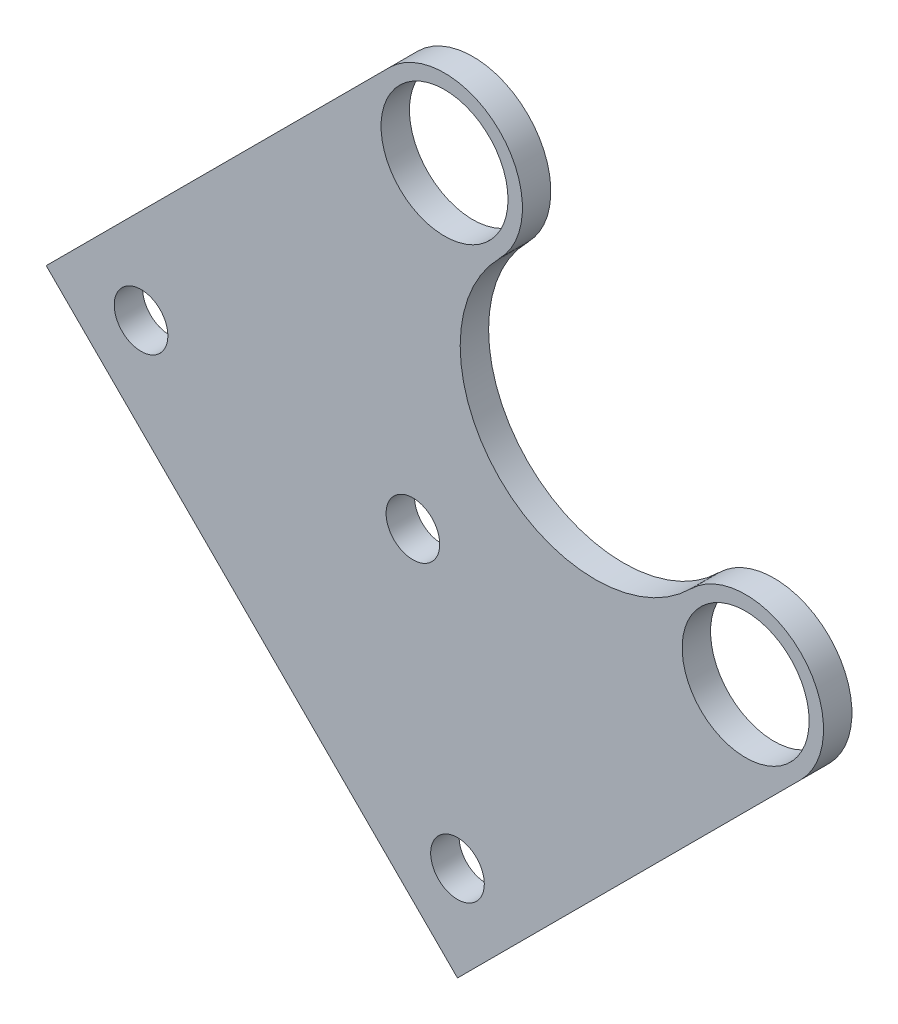
ISO-10303-21;
HEADER;
FILE_DESCRIPTION(('STEP AP214'),'2;1');
FILE_NAME('part.step','',(''),(''),'','','');
FILE_SCHEMA(('AUTOMOTIVE_DESIGN { 1 0 10303 214 1 1 1 1 }'));
ENDSEC;
DATA;
#1=APPLICATION_CONTEXT('core data for automotive mechanical design processes');
#2=APPLICATION_PROTOCOL_DEFINITION('international standard','automotive_design',2000,#1);
#3=PRODUCT_CONTEXT('',#1,'mechanical');
#4=PRODUCT('Part','Part','',(#3));
#5=PRODUCT_RELATED_PRODUCT_CATEGORY('part','',(#4));
#6=PRODUCT_DEFINITION_FORMATION('','',#4);
#7=PRODUCT_DEFINITION_CONTEXT('part definition',#1,'design');
#8=PRODUCT_DEFINITION('design','',#6,#7);
#9=PRODUCT_DEFINITION_SHAPE('','',#8);
#10=(LENGTH_UNIT() NAMED_UNIT(*) SI_UNIT(.MILLI.,.METRE.));
#11=(NAMED_UNIT(*) PLANE_ANGLE_UNIT() SI_UNIT($,.RADIAN.));
#12=(NAMED_UNIT(*) SI_UNIT($,.STERADIAN.) SOLID_ANGLE_UNIT());
#13=UNCERTAINTY_MEASURE_WITH_UNIT(LENGTH_MEASURE(1.E-05),#10,'distance_accuracy_value','');
#14=(GEOMETRIC_REPRESENTATION_CONTEXT(3) GLOBAL_UNCERTAINTY_ASSIGNED_CONTEXT((#13)) GLOBAL_UNIT_ASSIGNED_CONTEXT((#10,
#11,#12)) REPRESENTATION_CONTEXT('',''));
#15=CARTESIAN_POINT('',(0.,0.,0.));
#16=DIRECTION('',(0.,0.,1.));
#17=DIRECTION('',(1.,0.,0.));
#18=AXIS2_PLACEMENT_3D('',#15,#16,#17);
#19=CARTESIAN_POINT('',(15.9750784843009,15.9750784843008,3.175));
#20=DIRECTION('',(-0.70710678118655,-0.707106781186545,0.));
#21=DIRECTION('',(0.707106781186545,-0.70710678118655,0.));
#22=AXIS2_PLACEMENT_3D('',#19,#20,#21);
#23=PLANE('',#22);
#24=DIRECTION('',(-0.707106781186545,0.70710678118655,0.));
#25=VECTOR('',#24,1.);
#26=CARTESIAN_POINT('',(15.9750784843009,15.9750784843008,0.));
#27=LINE('',#26,#25);
#28=CARTESIAN_POINT('',(17.1358644103588,14.8142925582428,0.));
#29=VERTEX_POINT('',#28);
#30=CARTESIAN_POINT('',(-28.8610074417573,60.8111644103593,0.));
#31=VERTEX_POINT('',#30);
#32=EDGE_CURVE('E179',#29,#31,#27,.T.);
#33=ORIENTED_EDGE('',*,*,#32,.F.);
#34=DIRECTION('',(0.,0.,-1.));
#35=VECTOR('',#34,1.);
#36=CARTESIAN_POINT('',(17.1358644103588,14.8142925582428,3.175));
#37=LINE('',#36,#35);
#38=CARTESIAN_POINT('',(17.1358644103588,14.8142925582428,3.175));
#39=VERTEX_POINT('',#38);
#40=EDGE_CURVE('E11',#39,#29,#37,.T.);
#41=ORIENTED_EDGE('',*,*,#40,.F.);
#42=DIRECTION('',(-0.707106781186545,0.70710678118655,0.));
#43=VECTOR('',#42,1.);
#44=CARTESIAN_POINT('',(15.9750784843009,15.9750784843008,3.175));
#45=LINE('',#44,#43);
#46=CARTESIAN_POINT('',(-28.8610074417573,60.8111644103593,3.175));
#47=VERTEX_POINT('',#46);
#48=EDGE_CURVE('E289',#39,#47,#45,.T.);
#49=ORIENTED_EDGE('',*,*,#48,.T.);
#50=DIRECTION('',(0.,0.,-1.));
#51=VECTOR('',#50,1.);
#52=CARTESIAN_POINT('',(-28.8610074417573,60.8111644103593,3.175));
#53=LINE('',#52,#51);
#54=EDGE_CURVE('E97',#47,#31,#53,.T.);
#55=ORIENTED_EDGE('',*,*,#54,.T.);
#56=EDGE_LOOP('',(#33,#41,#49,#55));
#57=FACE_BOUND('',#56,.T.);
#58=ADVANCED_FACE('F45',(#57),#23,.T.);
#59=CARTESIAN_POINT('',(1.16078592605792,-1.16078592605793,3.175));
#60=DIRECTION('',(0.707106781186545,-0.70710678118655,0.));
#61=DIRECTION('',(0.70710678118655,0.707106781186545,0.));
#62=AXIS2_PLACEMENT_3D('',#59,#60,#61);
#63=PLANE('',#62);
#64=DIRECTION('',(-0.70710678118655,-0.707106781186545,0.));
#65=VECTOR('',#64,1.);
#66=CARTESIAN_POINT('',(1.16078592605792,-1.16078592605793,0.));
#67=LINE('',#66,#65);
#68=CARTESIAN_POINT('',(55.5231359260591,53.2015640739429,0.));
#69=VERTEX_POINT('',#68);
#70=EDGE_CURVE('E171',#69,#29,#67,.T.);
#71=ORIENTED_EDGE('',*,*,#70,.F.);
#72=DIRECTION('',(0.,0.,-1.));
#73=VECTOR('',#72,1.);
#74=CARTESIAN_POINT('',(55.5231359260591,53.2015640739429,3.175));
#75=LINE('',#74,#73);
#76=CARTESIAN_POINT('',(55.5231359260591,53.2015640739429,3.175));
#77=VERTEX_POINT('',#76);
#78=EDGE_CURVE('E55',#77,#69,#75,.T.);
#79=ORIENTED_EDGE('',*,*,#78,.F.);
#80=DIRECTION('',(-0.70710678118655,-0.707106781186545,0.));
#81=VECTOR('',#80,1.);
#82=CARTESIAN_POINT('',(1.16078592605792,-1.16078592605793,3.175));
#83=LINE('',#82,#81);
#84=EDGE_CURVE('E293',#77,#39,#83,.T.);
#85=ORIENTED_EDGE('',*,*,#84,.T.);
#86=ORIENTED_EDGE('',*,*,#40,.T.);
#87=EDGE_LOOP('',(#71,#79,#85,#86));
#88=FACE_BOUND('',#87,.T.);
#89=ADVANCED_FACE('F177',(#88),#63,.T.);
#90=CARTESIAN_POINT('',(49.3626802270047,59.3620197729953,3.175));
#91=DIRECTION('',(0.,0.,-1.));
#92=DIRECTION('',(-1.,0.,0.));
#93=AXIS2_PLACEMENT_3D('',#90,#91,#92);
#94=CYLINDRICAL_SURFACE('',#93,8.71219999999999);
#95=CARTESIAN_POINT('',(49.3626802270047,59.3620197729953,0.));
#96=DIRECTION('',(0.,0.,1.));
#97=DIRECTION('',(1.,0.,0.));
#98=AXIS2_PLACEMENT_3D('',#95,#96,#97);
#99=CIRCLE('',#98,8.71219999999999);
#100=CARTESIAN_POINT('',(43.2022245279513,65.5224754720488,0.));
#101=VERTEX_POINT('',#100);
#102=EDGE_CURVE('E161',#69,#101,#99,.T.);
#103=ORIENTED_EDGE('',*,*,#102,.T.);
#104=DIRECTION('',(0.,0.,-1.));
#105=VECTOR('',#104,1.);
#106=CARTESIAN_POINT('',(43.2022245279513,65.5224754720488,3.175));
#107=LINE('',#106,#105);
#108=CARTESIAN_POINT('',(43.2022245279513,65.5224754720488,3.175));
#109=VERTEX_POINT('',#108);
#110=EDGE_CURVE('E151',#109,#101,#107,.T.);
#111=ORIENTED_EDGE('',*,*,#110,.F.);
#112=CARTESIAN_POINT('',(49.3626802270047,59.3620197729953,3.175));
#113=DIRECTION('',(0.,0.,1.));
#114=DIRECTION('',(1.,0.,0.));
#115=AXIS2_PLACEMENT_3D('',#112,#113,#114);
#116=CIRCLE('',#115,8.71219999999999);
#117=EDGE_CURVE('E163',#77,#109,#116,.T.);
#118=ORIENTED_EDGE('',*,*,#117,.F.);
#119=ORIENTED_EDGE('',*,*,#78,.T.);
#120=EDGE_LOOP('',(#103,#111,#118,#119));
#121=FACE_BOUND('',#120,.T.);
#122=ADVANCED_FACE('F159',(#121),#94,.T.);
#123=CARTESIAN_POINT('',(54.3623500000167,54.3623499999747,3.175));
#124=DIRECTION('',(-0.707106781186821,-0.707106781186274,0.));
#125=DIRECTION('',(0.707106781186274,-0.707106781186821,0.));
#126=AXIS2_PLACEMENT_3D('',#123,#124,#125);
#127=PLANE('',#126);
#128=DIRECTION('',(-0.707106781186274,0.707106781186821,0.));
#129=VECTOR('',#128,1.);
#130=CARTESIAN_POINT('',(54.3623500000167,54.3623499999747,0.));
#131=LINE('',#130,#129);
#132=CARTESIAN_POINT('',(43.1932442718302,65.5314557281699,0.));
#133=VERTEX_POINT('',#132);
#134=EDGE_CURVE('E174',#101,#133,#131,.T.);
#135=ORIENTED_EDGE('',*,*,#134,.T.);
#136=DIRECTION('',(0.,0.,-1.));
#137=VECTOR('',#136,1.);
#138=CARTESIAN_POINT('',(43.1932442718302,65.5314557281699,3.175));
#139=LINE('',#138,#137);
#140=CARTESIAN_POINT('',(43.1932442718302,65.5314557281699,3.175));
#141=VERTEX_POINT('',#140);
#142=EDGE_CURVE('E144',#141,#133,#139,.T.);
#143=ORIENTED_EDGE('',*,*,#142,.F.);
#144=DIRECTION('',(-0.707106781186274,0.707106781186821,0.));
#145=VECTOR('',#144,1.);
#146=CARTESIAN_POINT('',(54.3623500000167,54.3623499999747,3.175));
#147=LINE('',#146,#145);
#148=EDGE_CURVE('E301',#109,#141,#147,.T.);
#149=ORIENTED_EDGE('',*,*,#148,.F.);
#150=ORIENTED_EDGE('',*,*,#110,.T.);
#151=EDGE_LOOP('',(#135,#143,#149,#150));
#152=FACE_BOUND('',#151,.T.);
#153=ADVANCED_FACE('F255',(#152),#127,.F.);
#154=CARTESIAN_POINT('',(32.5247,76.2,3.175));
#155=DIRECTION('',(0.,0.,-1.));
#156=DIRECTION('',(-1.,0.,0.));
#157=AXIS2_PLACEMENT_3D('',#154,#155,#156);
#158=CYLINDRICAL_SURFACE('',#157,15.0876);
#159=CARTESIAN_POINT('',(32.5247,76.2,0.));
#160=DIRECTION('',(0.,0.,1.));
#161=DIRECTION('',(1.,0.,0.));
#162=AXIS2_PLACEMENT_3D('',#159,#160,#161);
#163=CIRCLE('',#162,15.0876);
#164=CARTESIAN_POINT('',(21.8561557281699,86.8685442718302,0.));
#165=VERTEX_POINT('',#164);
#166=EDGE_CURVE('E188',#165,#133,#163,.T.);
#167=ORIENTED_EDGE('',*,*,#166,.F.);
#168=DIRECTION('',(0.,0.,-1.));
#169=VECTOR('',#168,1.);
#170=CARTESIAN_POINT('',(21.8561557281699,86.8685442718302,3.175));
#171=LINE('',#170,#169);
#172=CARTESIAN_POINT('',(21.8561557281699,86.8685442718302,3.175));
#173=VERTEX_POINT('',#172);
#174=EDGE_CURVE('E140',#173,#165,#171,.T.);
#175=ORIENTED_EDGE('',*,*,#174,.F.);
#176=CARTESIAN_POINT('',(32.5247,76.2,3.175));
#177=DIRECTION('',(0.,0.,1.));
#178=DIRECTION('',(1.,0.,0.));
#179=AXIS2_PLACEMENT_3D('',#176,#177,#178);
#180=CIRCLE('',#179,15.0876);
#181=EDGE_CURVE('E132',#173,#141,#180,.T.);
#182=ORIENTED_EDGE('',*,*,#181,.T.);
#183=ORIENTED_EDGE('',*,*,#142,.T.);
#184=EDGE_LOOP('',(#167,#175,#182,#183));
#185=FACE_BOUND('',#184,.T.);
#186=ADVANCED_FACE('F258',(#185),#158,.F.);
#187=CARTESIAN_POINT('',(54.3623499999409,54.362350000235,3.175));
#188=DIRECTION('',(-0.707106781184635,-0.70710678118846,0.));
#189=DIRECTION('',(0.70710678118846,-0.707106781184635,0.));
#190=AXIS2_PLACEMENT_3D('',#187,#188,#189);
#191=PLANE('',#190);
#192=DIRECTION('',(-0.70710678118846,0.707106781184635,0.));
#193=VECTOR('',#192,1.);
#194=CARTESIAN_POINT('',(54.3623499999409,54.362350000235,0.));
#195=LINE('',#194,#193);
#196=CARTESIAN_POINT('',(21.8471754720488,86.8775245279512,0.));
#197=VERTEX_POINT('',#196);
#198=EDGE_CURVE('E138',#165,#197,#195,.T.);
#199=ORIENTED_EDGE('',*,*,#198,.T.);
#200=DIRECTION('',(0.,0.,-1.));
#201=VECTOR('',#200,1.);
#202=CARTESIAN_POINT('',(21.8471754720488,86.8775245279512,3.175));
#203=LINE('',#202,#201);
#204=CARTESIAN_POINT('',(21.8471754720488,86.8775245279512,3.175));
#205=VERTEX_POINT('',#204);
#206=EDGE_CURVE('E121',#205,#197,#203,.T.);
#207=ORIENTED_EDGE('',*,*,#206,.F.);
#208=DIRECTION('',(-0.70710678118846,0.707106781184635,0.));
#209=VECTOR('',#208,1.);
#210=CARTESIAN_POINT('',(54.3623499999409,54.362350000235,3.175));
#211=LINE('',#210,#209);
#212=EDGE_CURVE('E125',#173,#205,#211,.T.);
#213=ORIENTED_EDGE('',*,*,#212,.F.);
#214=ORIENTED_EDGE('',*,*,#174,.T.);
#215=EDGE_LOOP('',(#199,#207,#213,#214));
#216=FACE_BOUND('',#215,.T.);
#217=ADVANCED_FACE('F136',(#216),#191,.F.);
#218=CARTESIAN_POINT('',(15.6867197729953,93.0379802270047,3.175));
#219=DIRECTION('',(0.,0.,-1.));
#220=DIRECTION('',(-1.,0.,0.));
#221=AXIS2_PLACEMENT_3D('',#218,#219,#220);
#222=CYLINDRICAL_SURFACE('',#221,8.71220000000003);
#223=CARTESIAN_POINT('',(15.6867197729953,93.0379802270047,0.));
#224=DIRECTION('',(0.,0.,1.));
#225=DIRECTION('',(1.,0.,0.));
#226=AXIS2_PLACEMENT_3D('',#223,#224,#225);
#227=CIRCLE('',#226,8.71220000000003);
#228=CARTESIAN_POINT('',(9.52626407394171,99.198435926058,0.));
#229=VERTEX_POINT('',#228);
#230=EDGE_CURVE('E193',#197,#229,#227,.T.);
#231=ORIENTED_EDGE('',*,*,#230,.T.);
#232=DIRECTION('',(0.,0.,-1.));
#233=VECTOR('',#232,1.);
#234=CARTESIAN_POINT('',(9.52626407394171,99.198435926058,3.175));
#235=LINE('',#234,#233);
#236=CARTESIAN_POINT('',(9.52626407394171,99.198435926058,3.175));
#237=VERTEX_POINT('',#236);
#238=EDGE_CURVE('E123',#237,#229,#235,.T.);
#239=ORIENTED_EDGE('',*,*,#238,.F.);
#240=CARTESIAN_POINT('',(15.6867197729953,93.0379802270047,3.175));
#241=DIRECTION('',(0.,0.,1.));
#242=DIRECTION('',(1.,0.,0.));
#243=AXIS2_PLACEMENT_3D('',#240,#241,#242);
#244=CIRCLE('',#243,8.71220000000003);
#245=EDGE_CURVE('E116',#205,#237,#244,.T.);
#246=ORIENTED_EDGE('',*,*,#245,.F.);
#247=ORIENTED_EDGE('',*,*,#206,.T.);
#248=EDGE_LOOP('',(#231,#239,#246,#247));
#249=FACE_BOUND('',#248,.T.);
#250=ADVANCED_FACE('F119',(#249),#222,.T.);
#251=CARTESIAN_POINT('',(49.3626802270047,59.3620197729953,3.175));
#252=DIRECTION('',(0.,0.,-1.));
#253=DIRECTION('',(-1.,0.,0.));
#254=AXIS2_PLACEMENT_3D('',#251,#252,#253);
#255=CYLINDRICAL_SURFACE('',#254,7.1);
#256=CARTESIAN_POINT('',(49.3626802270047,59.3620197729953,3.175));
#257=DIRECTION('',(0.,0.,1.));
#258=DIRECTION('',(1.,0.,0.));
#259=AXIS2_PLACEMENT_3D('',#256,#257,#258);
#260=CIRCLE('',#259,7.1);
#261=CARTESIAN_POINT('',(56.4626802270047,59.3620197729953,3.175));
#262=VERTEX_POINT('',#261);
#263=EDGE_CURVE('E214',#262,#262,#260,.T.);
#264=ORIENTED_EDGE('',*,*,#263,.T.);
#265=EDGE_LOOP('',(#264));
#266=FACE_BOUND('',#265,.T.);
#267=CARTESIAN_POINT('',(49.3626802270047,59.3620197729953,0.));
#268=DIRECTION('',(0.,0.,1.));
#269=DIRECTION('',(1.,0.,0.));
#270=AXIS2_PLACEMENT_3D('',#267,#268,#269);
#271=CIRCLE('',#270,7.1);
#272=CARTESIAN_POINT('',(56.4626802270047,59.3620197729953,0.));
#273=VERTEX_POINT('',#272);
#274=EDGE_CURVE('E202',#273,#273,#271,.T.);
#275=ORIENTED_EDGE('',*,*,#274,.F.);
#276=EDGE_LOOP('',(#275));
#277=FACE_BOUND('',#276,.T.);
#278=ADVANCED_FACE('F266',(#266,#277),#255,.F.);
#279=CARTESIAN_POINT('',(12.1511858670625,55.8264858670626,3.175));
#280=DIRECTION('',(0.,0.,-1.));
#281=DIRECTION('',(-1.,0.,0.));
#282=AXIS2_PLACEMENT_3D('',#279,#280,#281);
#283=CYLINDRICAL_SURFACE('',#282,3.00000000000002);
#284=CARTESIAN_POINT('',(12.1511858670625,55.8264858670626,3.175));
#285=DIRECTION('',(0.,0.,1.));
#286=DIRECTION('',(1.,0.,0.));
#287=AXIS2_PLACEMENT_3D('',#284,#285,#286);
#288=CIRCLE('',#287,3.00000000000002);
#289=CARTESIAN_POINT('',(15.1511858670625,55.8264858670626,3.175));
#290=VERTEX_POINT('',#289);
#291=EDGE_CURVE('E220',#290,#290,#288,.T.);
#292=ORIENTED_EDGE('',*,*,#291,.T.);
#293=EDGE_LOOP('',(#292));
#294=FACE_BOUND('',#293,.T.);
#295=CARTESIAN_POINT('',(12.1511858670625,55.8264858670626,0.));
#296=DIRECTION('',(0.,0.,1.));
#297=DIRECTION('',(1.,0.,0.));
#298=AXIS2_PLACEMENT_3D('',#295,#296,#297);
#299=CIRCLE('',#298,3.00000000000002);
#300=CARTESIAN_POINT('',(15.1511858670625,55.8264858670626,0.));
#301=VERTEX_POINT('',#300);
#302=EDGE_CURVE('E198',#301,#301,#299,.T.);
#303=ORIENTED_EDGE('',*,*,#302,.F.);
#304=EDGE_LOOP('',(#303));
#305=FACE_BOUND('',#304,.T.);
#306=ADVANCED_FACE('F242',(#294,#305),#283,.F.);
#307=CARTESIAN_POINT('',(-44.8360859260582,44.8360859260585,3.175));
#308=DIRECTION('',(0.707106781186545,-0.70710678118655,0.));
#309=DIRECTION('',(0.70710678118655,0.707106781186545,0.));
#310=AXIS2_PLACEMENT_3D('',#307,#308,#309);
#311=PLANE('',#310);
#312=DIRECTION('',(-0.70710678118655,-0.707106781186545,0.));
#313=VECTOR('',#312,1.);
#314=CARTESIAN_POINT('',(-44.8360859260582,44.8360859260585,0.));
#315=LINE('',#314,#313);
#316=EDGE_CURVE('E90',#229,#31,#315,.T.);
#317=ORIENTED_EDGE('',*,*,#316,.T.);
#318=ORIENTED_EDGE('',*,*,#54,.F.);
#319=DIRECTION('',(-0.70710678118655,-0.707106781186545,0.));
#320=VECTOR('',#319,1.);
#321=CARTESIAN_POINT('',(-44.8360859260582,44.8360859260585,3.175));
#322=LINE('',#321,#320);
#323=EDGE_CURVE('E63',#237,#47,#322,.T.);
#324=ORIENTED_EDGE('',*,*,#323,.F.);
#325=ORIENTED_EDGE('',*,*,#238,.T.);
#326=EDGE_LOOP('',(#317,#318,#324,#325));
#327=FACE_BOUND('',#326,.T.);
#328=ADVANCED_FACE('F234',(#327),#311,.F.);
#329=CARTESIAN_POINT('',(-18.254405723959,60.8111644103593,3.175));
#330=DIRECTION('',(0.,0.,-1.));
#331=DIRECTION('',(-1.,0.,0.));
#332=AXIS2_PLACEMENT_3D('',#329,#330,#331);
#333=CYLINDRICAL_SURFACE('',#332,3.);
#334=CARTESIAN_POINT('',(-18.254405723959,60.8111644103593,3.175));
#335=DIRECTION('',(0.,0.,1.));
#336=DIRECTION('',(1.,0.,0.));
#337=AXIS2_PLACEMENT_3D('',#334,#335,#336);
#338=CIRCLE('',#337,3.);
#339=CARTESIAN_POINT('',(-15.254405723959,60.8111644103593,3.175));
#340=VERTEX_POINT('',#339);
#341=EDGE_CURVE('E287',#340,#340,#338,.T.);
#342=ORIENTED_EDGE('',*,*,#341,.T.);
#343=EDGE_LOOP('',(#342));
#344=FACE_BOUND('',#343,.T.);
#345=CARTESIAN_POINT('',(-18.254405723959,60.8111644103593,0.));
#346=DIRECTION('',(0.,0.,1.));
#347=DIRECTION('',(1.,0.,0.));
#348=AXIS2_PLACEMENT_3D('',#345,#346,#347);
#349=CIRCLE('',#348,3.);
#350=CARTESIAN_POINT('',(-15.254405723959,60.8111644103593,0.));
#351=VERTEX_POINT('',#350);
#352=EDGE_CURVE('E182',#351,#351,#349,.T.);
#353=ORIENTED_EDGE('',*,*,#352,.F.);
#354=EDGE_LOOP('',(#353));
#355=FACE_BOUND('',#354,.T.);
#356=ADVANCED_FACE('F232',(#344,#355),#333,.F.);
#357=CARTESIAN_POINT('',(17.1358644103588,25.420894276041,3.175));
#358=DIRECTION('',(0.,0.,-1.));
#359=DIRECTION('',(-1.,0.,0.));
#360=AXIS2_PLACEMENT_3D('',#357,#358,#359);
#361=CYLINDRICAL_SURFACE('',#360,3.);
#362=CARTESIAN_POINT('',(17.1358644103588,25.420894276041,3.175));
#363=DIRECTION('',(0.,0.,1.));
#364=DIRECTION('',(1.,0.,0.));
#365=AXIS2_PLACEMENT_3D('',#362,#363,#364);
#366=CIRCLE('',#365,3.);
#367=CARTESIAN_POINT('',(20.1358644103588,25.420894276041,3.175));
#368=VERTEX_POINT('',#367);
#369=EDGE_CURVE('E209',#368,#368,#366,.T.);
#370=ORIENTED_EDGE('',*,*,#369,.T.);
#371=EDGE_LOOP('',(#370));
#372=FACE_BOUND('',#371,.T.);
#373=CARTESIAN_POINT('',(17.1358644103588,25.420894276041,0.));
#374=DIRECTION('',(0.,0.,1.));
#375=DIRECTION('',(1.,0.,0.));
#376=AXIS2_PLACEMENT_3D('',#373,#374,#375);
#377=CIRCLE('',#376,3.);
#378=CARTESIAN_POINT('',(20.1358644103588,25.420894276041,0.));
#379=VERTEX_POINT('',#378);
#380=EDGE_CURVE('E224',#379,#379,#377,.T.);
#381=ORIENTED_EDGE('',*,*,#380,.F.);
#382=EDGE_LOOP('',(#381));
#383=FACE_BOUND('',#382,.T.);
#384=ADVANCED_FACE('F47',(#372,#383),#361,.F.);
#385=CARTESIAN_POINT('',(15.6867197729953,93.0379802270047,3.175));
#386=DIRECTION('',(0.,0.,-1.));
#387=DIRECTION('',(-1.,0.,0.));
#388=AXIS2_PLACEMENT_3D('',#385,#386,#387);
#389=CYLINDRICAL_SURFACE('',#388,7.1);
#390=CARTESIAN_POINT('',(15.6867197729953,93.0379802270047,3.175));
#391=DIRECTION('',(0.,0.,1.));
#392=DIRECTION('',(1.,0.,0.));
#393=AXIS2_PLACEMENT_3D('',#390,#391,#392);
#394=CIRCLE('',#393,7.1);
#395=CARTESIAN_POINT('',(22.7867197729953,93.0379802270047,3.175));
#396=VERTEX_POINT('',#395);
#397=EDGE_CURVE('E211',#396,#396,#394,.T.);
#398=ORIENTED_EDGE('',*,*,#397,.T.);
#399=EDGE_LOOP('',(#398));
#400=FACE_BOUND('',#399,.T.);
#401=CARTESIAN_POINT('',(15.6867197729953,93.0379802270047,0.));
#402=DIRECTION('',(0.,0.,1.));
#403=DIRECTION('',(1.,0.,0.));
#404=AXIS2_PLACEMENT_3D('',#401,#402,#403);
#405=CIRCLE('',#404,7.1);
#406=CARTESIAN_POINT('',(22.7867197729953,93.0379802270047,0.));
#407=VERTEX_POINT('',#406);
#408=EDGE_CURVE('E206',#407,#407,#405,.T.);
#409=ORIENTED_EDGE('',*,*,#408,.F.);
#410=EDGE_LOOP('',(#409));
#411=FACE_BOUND('',#410,.T.);
#412=ADVANCED_FACE('F240',(#400,#411),#389,.F.);
#413=CARTESIAN_POINT('',(0.,0.,3.175));
#414=DIRECTION('',(0.,0.,1.));
#415=DIRECTION('',(1.,0.,0.));
#416=AXIS2_PLACEMENT_3D('',#413,#414,#415);
#417=PLANE('',#416);
#418=ORIENTED_EDGE('',*,*,#369,.F.);
#419=EDGE_LOOP('',(#418));
#420=FACE_BOUND('',#419,.T.);
#421=ORIENTED_EDGE('',*,*,#341,.F.);
#422=EDGE_LOOP('',(#421));
#423=FACE_BOUND('',#422,.T.);
#424=ORIENTED_EDGE('',*,*,#48,.F.);
#425=ORIENTED_EDGE('',*,*,#84,.F.);
#426=ORIENTED_EDGE('',*,*,#117,.T.);
#427=ORIENTED_EDGE('',*,*,#148,.T.);
#428=ORIENTED_EDGE('',*,*,#181,.F.);
#429=ORIENTED_EDGE('',*,*,#212,.T.);
#430=ORIENTED_EDGE('',*,*,#245,.T.);
#431=ORIENTED_EDGE('',*,*,#323,.T.);
#432=EDGE_LOOP('',(#424,#425,#426,#427,#428,#429,#430,#431));
#433=FACE_BOUND('',#432,.T.);
#434=ORIENTED_EDGE('',*,*,#291,.F.);
#435=EDGE_LOOP('',(#434));
#436=FACE_BOUND('',#435,.T.);
#437=ORIENTED_EDGE('',*,*,#263,.F.);
#438=EDGE_LOOP('',(#437));
#439=FACE_BOUND('',#438,.T.);
#440=ORIENTED_EDGE('',*,*,#397,.F.);
#441=EDGE_LOOP('',(#440));
#442=FACE_BOUND('',#441,.T.);
#443=ADVANCED_FACE('F129',(#420,#423,#433,#436,#439,#442),#417,.T.);
#444=CARTESIAN_POINT('',(0.,0.,0.));
#445=DIRECTION('',(0.,0.,1.));
#446=DIRECTION('',(1.,0.,0.));
#447=AXIS2_PLACEMENT_3D('',#444,#445,#446);
#448=PLANE('',#447);
#449=ORIENTED_EDGE('',*,*,#380,.T.);
#450=EDGE_LOOP('',(#449));
#451=FACE_BOUND('',#450,.T.);
#452=ORIENTED_EDGE('',*,*,#352,.T.);
#453=EDGE_LOOP('',(#452));
#454=FACE_BOUND('',#453,.T.);
#455=ORIENTED_EDGE('',*,*,#32,.T.);
#456=ORIENTED_EDGE('',*,*,#316,.F.);
#457=ORIENTED_EDGE('',*,*,#230,.F.);
#458=ORIENTED_EDGE('',*,*,#198,.F.);
#459=ORIENTED_EDGE('',*,*,#166,.T.);
#460=ORIENTED_EDGE('',*,*,#134,.F.);
#461=ORIENTED_EDGE('',*,*,#102,.F.);
#462=ORIENTED_EDGE('',*,*,#70,.T.);
#463=EDGE_LOOP('',(#455,#456,#457,#458,#459,#460,#461,#462));
#464=FACE_BOUND('',#463,.T.);
#465=ORIENTED_EDGE('',*,*,#302,.T.);
#466=EDGE_LOOP('',(#465));
#467=FACE_BOUND('',#466,.T.);
#468=ORIENTED_EDGE('',*,*,#274,.T.);
#469=EDGE_LOOP('',(#468));
#470=FACE_BOUND('',#469,.T.);
#471=ORIENTED_EDGE('',*,*,#408,.T.);
#472=EDGE_LOOP('',(#471));
#473=FACE_BOUND('',#472,.T.);
#474=ADVANCED_FACE('F169',(#451,#454,#464,#467,#470,#473),#448,.F.);
#475=CLOSED_SHELL('',(#58,#89,#122,#153,#186,#217,#250,#278,#306,#328,#356,#384,#412,#443,#474));
#476=MANIFOLD_SOLID_BREP('B2',#475);
#477=ADVANCED_BREP_SHAPE_REPRESENTATION('',(#18,#476),#14);
#478=SHAPE_DEFINITION_REPRESENTATION(#9,#477);
ENDSEC;
END-ISO-10303-21;
